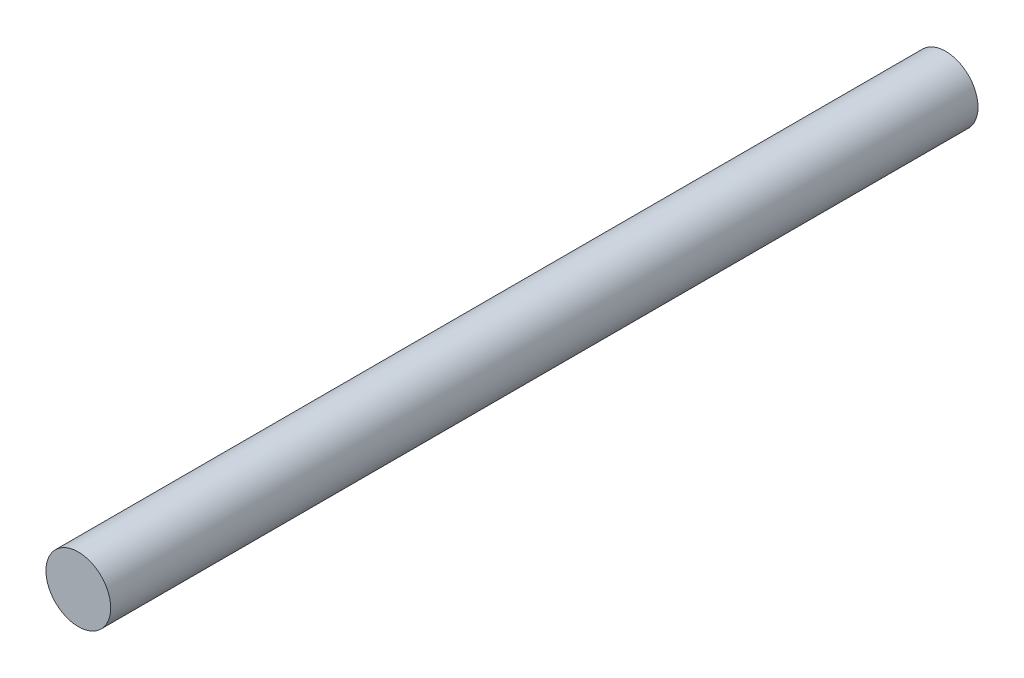
ISO-10303-21;
HEADER;
FILE_DESCRIPTION(('STEP AP214'),'2;1');
FILE_NAME('part.step','',(''),(''),'','','');
FILE_SCHEMA(('AUTOMOTIVE_DESIGN { 1 0 10303 214 1 1 1 1 }'));
ENDSEC;
DATA;
#1=APPLICATION_CONTEXT('core data for automotive mechanical design processes');
#2=APPLICATION_PROTOCOL_DEFINITION('international standard','automotive_design',2000,#1);
#3=PRODUCT_CONTEXT('',#1,'mechanical');
#4=PRODUCT('Part','Part','',(#3));
#5=PRODUCT_RELATED_PRODUCT_CATEGORY('part','',(#4));
#6=PRODUCT_DEFINITION_FORMATION('','',#4);
#7=PRODUCT_DEFINITION_CONTEXT('part definition',#1,'design');
#8=PRODUCT_DEFINITION('design','',#6,#7);
#9=PRODUCT_DEFINITION_SHAPE('','',#8);
#10=(LENGTH_UNIT() NAMED_UNIT(*) SI_UNIT(.MILLI.,.METRE.));
#11=(NAMED_UNIT(*) PLANE_ANGLE_UNIT() SI_UNIT($,.RADIAN.));
#12=(NAMED_UNIT(*) SI_UNIT($,.STERADIAN.) SOLID_ANGLE_UNIT());
#13=UNCERTAINTY_MEASURE_WITH_UNIT(LENGTH_MEASURE(1.E-05),#10,'distance_accuracy_value','');
#14=(GEOMETRIC_REPRESENTATION_CONTEXT(3) GLOBAL_UNCERTAINTY_ASSIGNED_CONTEXT((#13)) GLOBAL_UNIT_ASSIGNED_CONTEXT((#10,
#11,#12)) REPRESENTATION_CONTEXT('',''));
#15=CARTESIAN_POINT('',(0.,0.,0.));
#16=DIRECTION('',(0.,0.,1.));
#17=DIRECTION('',(1.,0.,0.));
#18=AXIS2_PLACEMENT_3D('',#15,#16,#17);
#19=CARTESIAN_POINT('',(0.,0.,-375.));
#20=DIRECTION('',(0.,0.,1.));
#21=DIRECTION('',(1.,0.,0.));
#22=AXIS2_PLACEMENT_3D('',#19,#20,#21);
#23=CYLINDRICAL_SURFACE('',#22,28.);
#24=CARTESIAN_POINT('',(0.,0.,-375.));
#25=DIRECTION('',(0.,0.,1.));
#26=DIRECTION('',(1.,0.,0.));
#27=AXIS2_PLACEMENT_3D('',#24,#25,#26);
#28=CIRCLE('',#27,28.);
#29=CARTESIAN_POINT('',(28.,0.,-375.));
#30=VERTEX_POINT('',#29);
#31=EDGE_CURVE('E10',#30,#30,#28,.T.);
#32=ORIENTED_EDGE('',*,*,#31,.T.);
#33=EDGE_LOOP('',(#32));
#34=FACE_BOUND('',#33,.T.);
#35=CARTESIAN_POINT('',(0.,0.,375.));
#36=DIRECTION('',(0.,0.,1.));
#37=DIRECTION('',(1.,0.,0.));
#38=AXIS2_PLACEMENT_3D('',#35,#36,#37);
#39=CIRCLE('',#38,28.);
#40=CARTESIAN_POINT('',(28.,0.,375.));
#41=VERTEX_POINT('',#40);
#42=EDGE_CURVE('E47',#41,#41,#39,.T.);
#43=ORIENTED_EDGE('',*,*,#42,.F.);
#44=EDGE_LOOP('',(#43));
#45=FACE_BOUND('',#44,.T.);
#46=ADVANCED_FACE('F41',(#34,#45),#23,.T.);
#47=CARTESIAN_POINT('',(0.,0.,-375.));
#48=DIRECTION('',(0.,0.,1.));
#49=DIRECTION('',(1.,0.,0.));
#50=AXIS2_PLACEMENT_3D('',#47,#48,#49);
#51=PLANE('',#50);
#52=ORIENTED_EDGE('',*,*,#31,.F.);
#53=EDGE_LOOP('',(#52));
#54=FACE_BOUND('',#53,.T.);
#55=ADVANCED_FACE('F56',(#54),#51,.F.);
#56=CARTESIAN_POINT('',(0.,0.,375.));
#57=DIRECTION('',(0.,0.,1.));
#58=DIRECTION('',(1.,0.,0.));
#59=AXIS2_PLACEMENT_3D('',#56,#57,#58);
#60=PLANE('',#59);
#61=ORIENTED_EDGE('',*,*,#42,.T.);
#62=EDGE_LOOP('',(#61));
#63=FACE_BOUND('',#62,.T.);
#64=ADVANCED_FACE('F53',(#63),#60,.T.);
#65=CLOSED_SHELL('',(#46,#55,#64));
#66=MANIFOLD_SOLID_BREP('B2',#65);
#67=ADVANCED_BREP_SHAPE_REPRESENTATION('',(#18,#66),#14);
#68=SHAPE_DEFINITION_REPRESENTATION(#9,#67);
ENDSEC;
END-ISO-10303-21;
